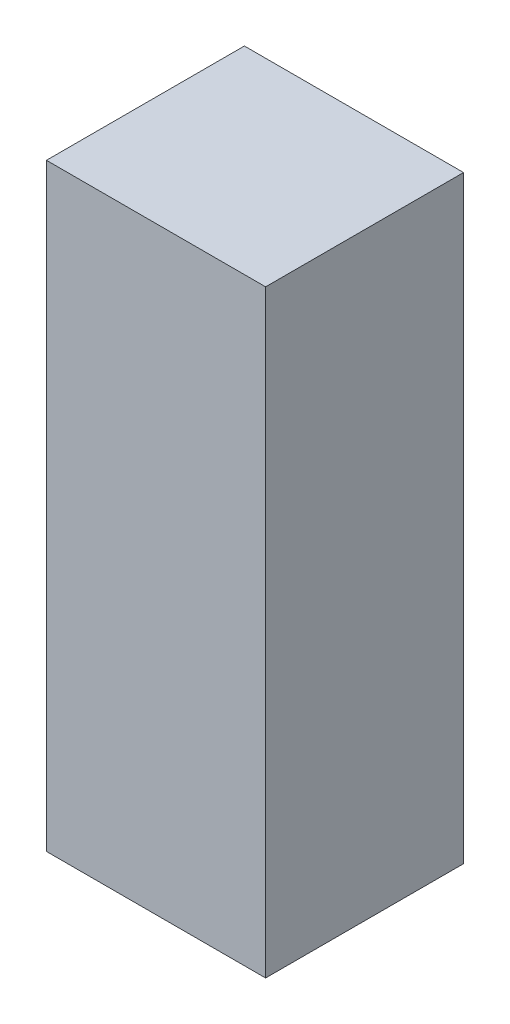
ISO-10303-21;
HEADER;
FILE_DESCRIPTION(('STEP AP214'),'2;1');
FILE_NAME('part.step','',(''),(''),'','','');
FILE_SCHEMA(('AUTOMOTIVE_DESIGN { 1 0 10303 214 1 1 1 1 }'));
ENDSEC;
DATA;
#1=APPLICATION_CONTEXT('core data for automotive mechanical design processes');
#2=APPLICATION_PROTOCOL_DEFINITION('international standard','automotive_design',2000,#1);
#3=PRODUCT_CONTEXT('',#1,'mechanical');
#4=PRODUCT('Part','Part','',(#3));
#5=PRODUCT_RELATED_PRODUCT_CATEGORY('part','',(#4));
#6=PRODUCT_DEFINITION_FORMATION('','',#4);
#7=PRODUCT_DEFINITION_CONTEXT('part definition',#1,'design');
#8=PRODUCT_DEFINITION('design','',#6,#7);
#9=PRODUCT_DEFINITION_SHAPE('','',#8);
#10=(LENGTH_UNIT() NAMED_UNIT(*) SI_UNIT(.MILLI.,.METRE.));
#11=(NAMED_UNIT(*) PLANE_ANGLE_UNIT() SI_UNIT($,.RADIAN.));
#12=(NAMED_UNIT(*) SI_UNIT($,.STERADIAN.) SOLID_ANGLE_UNIT());
#13=UNCERTAINTY_MEASURE_WITH_UNIT(LENGTH_MEASURE(1.E-05),#10,'distance_accuracy_value','');
#14=(GEOMETRIC_REPRESENTATION_CONTEXT(3) GLOBAL_UNCERTAINTY_ASSIGNED_CONTEXT((#13)) GLOBAL_UNIT_ASSIGNED_CONTEXT((#10,
#11,#12)) REPRESENTATION_CONTEXT('',''));
#15=CARTESIAN_POINT('',(0.,0.,0.));
#16=DIRECTION('',(0.,0.,1.));
#17=DIRECTION('',(1.,0.,0.));
#18=AXIS2_PLACEMENT_3D('',#15,#16,#17);
#19=CARTESIAN_POINT('',(-41.6478260869565,254.,-59.4391304347825));
#20=DIRECTION('',(1.,0.,0.));
#21=DIRECTION('',(0.,0.,-1.));
#22=AXIS2_PLACEMENT_3D('',#19,#20,#21);
#23=PLANE('',#22);
#24=DIRECTION('',(0.,0.,1.));
#25=VECTOR('',#24,1.);
#26=CARTESIAN_POINT('',(-41.6478260869565,0.,-59.4391304347825));
#27=LINE('',#26,#25);
#28=CARTESIAN_POINT('',(-41.6478260869565,0.,-59.4391304347825));
#29=VERTEX_POINT('',#28);
#30=CARTESIAN_POINT('',(-41.6478260869565,0.,24.5608695652175));
#31=VERTEX_POINT('',#30);
#32=EDGE_CURVE('E100',#29,#31,#27,.T.);
#33=ORIENTED_EDGE('',*,*,#32,.T.);
#34=DIRECTION('',(0.,-1.,0.));
#35=VECTOR('',#34,1.);
#36=CARTESIAN_POINT('',(-41.6478260869565,254.,24.5608695652175));
#37=LINE('',#36,#35);
#38=CARTESIAN_POINT('',(-41.6478260869565,254.,24.5608695652175));
#39=VERTEX_POINT('',#38);
#40=EDGE_CURVE('E11',#39,#31,#37,.T.);
#41=ORIENTED_EDGE('',*,*,#40,.F.);
#42=DIRECTION('',(0.,0.,1.));
#43=VECTOR('',#42,1.);
#44=CARTESIAN_POINT('',(-41.6478260869565,254.,-59.4391304347825));
#45=LINE('',#44,#43);
#46=CARTESIAN_POINT('',(-41.6478260869565,254.,-59.4391304347825));
#47=VERTEX_POINT('',#46);
#48=EDGE_CURVE('E88',#47,#39,#45,.T.);
#49=ORIENTED_EDGE('',*,*,#48,.F.);
#50=DIRECTION('',(0.,-1.,0.));
#51=VECTOR('',#50,1.);
#52=CARTESIAN_POINT('',(-41.6478260869565,254.,-59.4391304347825));
#53=LINE('',#52,#51);
#54=EDGE_CURVE('E96',#47,#29,#53,.T.);
#55=ORIENTED_EDGE('',*,*,#54,.T.);
#56=EDGE_LOOP('',(#33,#41,#49,#55));
#57=FACE_BOUND('',#56,.T.);
#58=ADVANCED_FACE('F37',(#57),#23,.F.);
#59=CARTESIAN_POINT('',(-41.6478260869565,254.,24.5608695652175));
#60=DIRECTION('',(0.,0.,-1.));
#61=DIRECTION('',(-1.,0.,0.));
#62=AXIS2_PLACEMENT_3D('',#59,#60,#61);
#63=PLANE('',#62);
#64=DIRECTION('',(1.,0.,0.));
#65=VECTOR('',#64,1.);
#66=CARTESIAN_POINT('',(-41.6478260869565,0.,24.5608695652175));
#67=LINE('',#66,#65);
#68=CARTESIAN_POINT('',(51.3521739130435,0.,24.5608695652175));
#69=VERTEX_POINT('',#68);
#70=EDGE_CURVE('E92',#31,#69,#67,.T.);
#71=ORIENTED_EDGE('',*,*,#70,.T.);
#72=DIRECTION('',(0.,-1.,0.));
#73=VECTOR('',#72,1.);
#74=CARTESIAN_POINT('',(51.3521739130435,254.,24.5608695652175));
#75=LINE('',#74,#73);
#76=CARTESIAN_POINT('',(51.3521739130435,254.,24.5608695652175));
#77=VERTEX_POINT('',#76);
#78=EDGE_CURVE('E45',#77,#69,#75,.T.);
#79=ORIENTED_EDGE('',*,*,#78,.F.);
#80=DIRECTION('',(1.,0.,0.));
#81=VECTOR('',#80,1.);
#82=CARTESIAN_POINT('',(-41.6478260869565,254.,24.5608695652175));
#83=LINE('',#82,#81);
#84=EDGE_CURVE('E83',#39,#77,#83,.T.);
#85=ORIENTED_EDGE('',*,*,#84,.F.);
#86=ORIENTED_EDGE('',*,*,#40,.T.);
#87=EDGE_LOOP('',(#71,#79,#85,#86));
#88=FACE_BOUND('',#87,.T.);
#89=ADVANCED_FACE('F91',(#88),#63,.F.);
#90=CARTESIAN_POINT('',(51.3521739130435,254.,-59.4391304347825));
#91=DIRECTION('',(-1.,0.,0.));
#92=DIRECTION('',(0.,0.,1.));
#93=AXIS2_PLACEMENT_3D('',#90,#91,#92);
#94=PLANE('',#93);
#95=DIRECTION('',(0.,0.,-1.));
#96=VECTOR('',#95,1.);
#97=CARTESIAN_POINT('',(51.3521739130435,0.,-59.4391304347825));
#98=LINE('',#97,#96);
#99=CARTESIAN_POINT('',(51.3521739130435,0.,-59.4391304347825));
#100=VERTEX_POINT('',#99);
#101=EDGE_CURVE('E70',#69,#100,#98,.T.);
#102=ORIENTED_EDGE('',*,*,#101,.T.);
#103=DIRECTION('',(0.,-1.,0.));
#104=VECTOR('',#103,1.);
#105=CARTESIAN_POINT('',(51.3521739130435,254.,-59.4391304347825));
#106=LINE('',#105,#104);
#107=CARTESIAN_POINT('',(51.3521739130435,254.,-59.4391304347825));
#108=VERTEX_POINT('',#107);
#109=EDGE_CURVE('E93',#108,#100,#106,.T.);
#110=ORIENTED_EDGE('',*,*,#109,.F.);
#111=DIRECTION('',(0.,0.,-1.));
#112=VECTOR('',#111,1.);
#113=CARTESIAN_POINT('',(51.3521739130435,254.,-59.4391304347825));
#114=LINE('',#113,#112);
#115=EDGE_CURVE('E86',#77,#108,#114,.T.);
#116=ORIENTED_EDGE('',*,*,#115,.F.);
#117=ORIENTED_EDGE('',*,*,#78,.T.);
#118=EDGE_LOOP('',(#102,#110,#116,#117));
#119=FACE_BOUND('',#118,.T.);
#120=ADVANCED_FACE('F94',(#119),#94,.F.);
#121=CARTESIAN_POINT('',(-41.6478260869565,254.,-59.4391304347825));
#122=DIRECTION('',(0.,0.,1.));
#123=DIRECTION('',(1.,0.,0.));
#124=AXIS2_PLACEMENT_3D('',#121,#122,#123);
#125=PLANE('',#124);
#126=DIRECTION('',(-1.,0.,0.));
#127=VECTOR('',#126,1.);
#128=CARTESIAN_POINT('',(-41.6478260869565,0.,-59.4391304347825));
#129=LINE('',#128,#127);
#130=EDGE_CURVE('E76',#100,#29,#129,.T.);
#131=ORIENTED_EDGE('',*,*,#130,.T.);
#132=ORIENTED_EDGE('',*,*,#54,.F.);
#133=DIRECTION('',(-1.,0.,0.));
#134=VECTOR('',#133,1.);
#135=CARTESIAN_POINT('',(-41.6478260869565,254.,-59.4391304347825));
#136=LINE('',#135,#134);
#137=EDGE_CURVE('E53',#108,#47,#136,.T.);
#138=ORIENTED_EDGE('',*,*,#137,.F.);
#139=ORIENTED_EDGE('',*,*,#109,.T.);
#140=EDGE_LOOP('',(#131,#132,#138,#139));
#141=FACE_BOUND('',#140,.T.);
#142=ADVANCED_FACE('F107',(#141),#125,.F.);
#143=CARTESIAN_POINT('',(0.,254.,0.));
#144=DIRECTION('',(0.,1.,0.));
#145=DIRECTION('',(0.,0.,1.));
#146=AXIS2_PLACEMENT_3D('',#143,#144,#145);
#147=PLANE('',#146);
#148=ORIENTED_EDGE('',*,*,#48,.T.);
#149=ORIENTED_EDGE('',*,*,#84,.T.);
#150=ORIENTED_EDGE('',*,*,#115,.T.);
#151=ORIENTED_EDGE('',*,*,#137,.T.);
#152=EDGE_LOOP('',(#148,#149,#150,#151));
#153=FACE_BOUND('',#152,.T.);
#154=ADVANCED_FACE('F84',(#153),#147,.T.);
#155=CARTESIAN_POINT('',(0.,0.,0.));
#156=DIRECTION('',(0.,1.,0.));
#157=DIRECTION('',(0.,0.,1.));
#158=AXIS2_PLACEMENT_3D('',#155,#156,#157);
#159=PLANE('',#158);
#160=ORIENTED_EDGE('',*,*,#32,.F.);
#161=ORIENTED_EDGE('',*,*,#130,.F.);
#162=ORIENTED_EDGE('',*,*,#101,.F.);
#163=ORIENTED_EDGE('',*,*,#70,.F.);
#164=EDGE_LOOP('',(#160,#161,#162,#163));
#165=FACE_BOUND('',#164,.T.);
#166=ADVANCED_FACE('F110',(#165),#159,.F.);
#167=CLOSED_SHELL('',(#58,#89,#120,#142,#154,#166));
#168=MANIFOLD_SOLID_BREP('B2',#167);
#169=ADVANCED_BREP_SHAPE_REPRESENTATION('',(#18,#168),#14);
#170=SHAPE_DEFINITION_REPRESENTATION(#9,#169);
ENDSEC;
END-ISO-10303-21;
